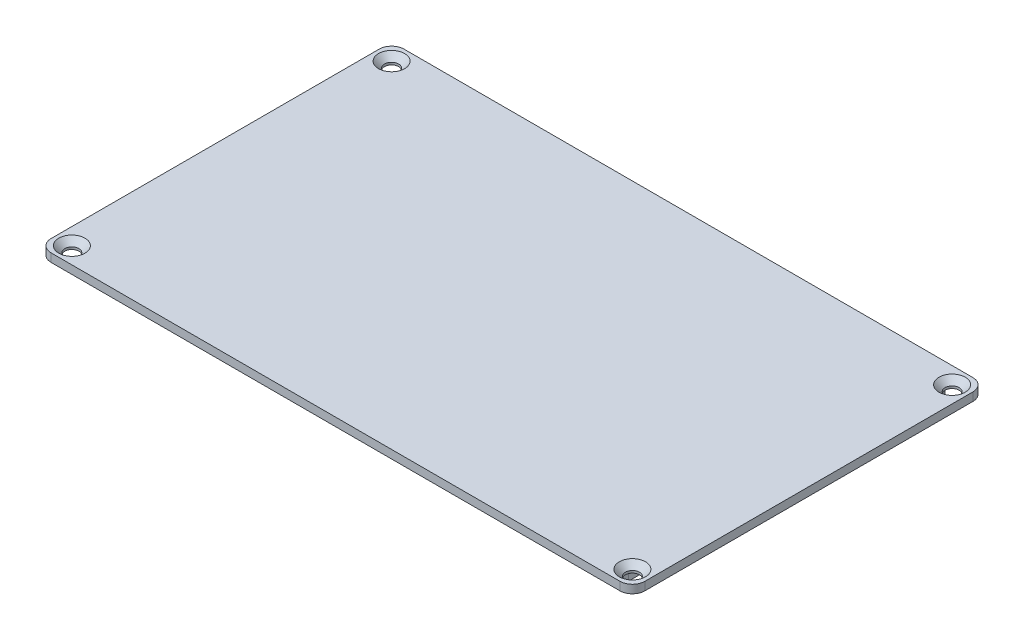
ISO-10303-21;
HEADER;
FILE_DESCRIPTION(('STEP AP214'),'2;1');
FILE_NAME('part.step','',(''),(''),'','','');
FILE_SCHEMA(('AUTOMOTIVE_DESIGN { 1 0 10303 214 1 1 1 1 }'));
ENDSEC;
DATA;
#1=APPLICATION_CONTEXT('core data for automotive mechanical design processes');
#2=APPLICATION_PROTOCOL_DEFINITION('international standard','automotive_design',2000,#1);
#3=PRODUCT_CONTEXT('',#1,'mechanical');
#4=PRODUCT('Part','Part','',(#3));
#5=PRODUCT_RELATED_PRODUCT_CATEGORY('part','',(#4));
#6=PRODUCT_DEFINITION_FORMATION('','',#4);
#7=PRODUCT_DEFINITION_CONTEXT('part definition',#1,'design');
#8=PRODUCT_DEFINITION('design','',#6,#7);
#9=PRODUCT_DEFINITION_SHAPE('','',#8);
#10=(LENGTH_UNIT() NAMED_UNIT(*) SI_UNIT(.MILLI.,.METRE.));
#11=(NAMED_UNIT(*) PLANE_ANGLE_UNIT() SI_UNIT($,.RADIAN.));
#12=(NAMED_UNIT(*) SI_UNIT($,.STERADIAN.) SOLID_ANGLE_UNIT());
#13=UNCERTAINTY_MEASURE_WITH_UNIT(LENGTH_MEASURE(1.E-05),#10,'distance_accuracy_value','');
#14=(GEOMETRIC_REPRESENTATION_CONTEXT(3) GLOBAL_UNCERTAINTY_ASSIGNED_CONTEXT((#13)) GLOBAL_UNIT_ASSIGNED_CONTEXT((#10,
#11,#12)) REPRESENTATION_CONTEXT('',''));
#15=CARTESIAN_POINT('',(0.,0.,0.));
#16=DIRECTION('',(0.,0.,1.));
#17=DIRECTION('',(1.,0.,0.));
#18=AXIS2_PLACEMENT_3D('',#15,#16,#17);
#19=CARTESIAN_POINT('',(0.,0.,0.));
#20=DIRECTION('',(0.,-1.,0.));
#21=DIRECTION('',(0.,0.,-1.));
#22=AXIS2_PLACEMENT_3D('',#19,#20,#21);
#23=PLANE('',#22);
#24=DIRECTION('',(0.,0.,-1.));
#25=VECTOR('',#24,1.);
#26=CARTESIAN_POINT('',(131.,0.,0.));
#27=LINE('',#26,#25);
#28=CARTESIAN_POINT('',(131.,0.,-3.));
#29=VERTEX_POINT('',#28);
#30=CARTESIAN_POINT('',(131.,0.,-78.));
#31=VERTEX_POINT('',#30);
#32=EDGE_CURVE('E224',#29,#31,#27,.T.);
#33=ORIENTED_EDGE('',*,*,#32,.F.);
#34=CARTESIAN_POINT('',(128.,0.,-3.));
#35=DIRECTION('',(0.,-1.,0.));
#36=DIRECTION('',(0.,0.,-1.));
#37=AXIS2_PLACEMENT_3D('',#34,#35,#36);
#38=CIRCLE('',#37,3.);
#39=CARTESIAN_POINT('',(128.,0.,0.));
#40=VERTEX_POINT('',#39);
#41=EDGE_CURVE('E239',#29,#40,#38,.T.);
#42=ORIENTED_EDGE('',*,*,#41,.T.);
#43=DIRECTION('',(1.,0.,0.));
#44=VECTOR('',#43,1.);
#45=CARTESIAN_POINT('',(0.,0.,0.));
#46=LINE('',#45,#44);
#47=CARTESIAN_POINT('',(3.,0.,0.));
#48=VERTEX_POINT('',#47);
#49=EDGE_CURVE('E202',#48,#40,#46,.T.);
#50=ORIENTED_EDGE('',*,*,#49,.F.);
#51=CARTESIAN_POINT('',(3.,0.,-3.));
#52=DIRECTION('',(0.,-1.,0.));
#53=DIRECTION('',(0.,0.,-1.));
#54=AXIS2_PLACEMENT_3D('',#51,#52,#53);
#55=CIRCLE('',#54,3.);
#56=CARTESIAN_POINT('',(0.,0.,-3.));
#57=VERTEX_POINT('',#56);
#58=EDGE_CURVE('E237',#48,#57,#55,.T.);
#59=ORIENTED_EDGE('',*,*,#58,.T.);
#60=DIRECTION('',(0.,0.,1.));
#61=VECTOR('',#60,1.);
#62=CARTESIAN_POINT('',(0.,0.,0.));
#63=LINE('',#62,#61);
#64=CARTESIAN_POINT('',(0.,0.,-78.));
#65=VERTEX_POINT('',#64);
#66=EDGE_CURVE('E198',#65,#57,#63,.T.);
#67=ORIENTED_EDGE('',*,*,#66,.F.);
#68=CARTESIAN_POINT('',(3.,0.,-78.));
#69=DIRECTION('',(0.,-1.,0.));
#70=DIRECTION('',(0.,0.,-1.));
#71=AXIS2_PLACEMENT_3D('',#68,#69,#70);
#72=CIRCLE('',#71,3.);
#73=CARTESIAN_POINT('',(3.,0.,-81.));
#74=VERTEX_POINT('',#73);
#75=EDGE_CURVE('E235',#65,#74,#72,.T.);
#76=ORIENTED_EDGE('',*,*,#75,.T.);
#77=DIRECTION('',(-1.,0.,0.));
#78=VECTOR('',#77,1.);
#79=CARTESIAN_POINT('',(0.,0.,-81.));
#80=LINE('',#79,#78);
#81=CARTESIAN_POINT('',(128.,0.,-81.));
#82=VERTEX_POINT('',#81);
#83=EDGE_CURVE('E212',#82,#74,#80,.T.);
#84=ORIENTED_EDGE('',*,*,#83,.F.);
#85=CARTESIAN_POINT('',(128.,0.,-78.));
#86=DIRECTION('',(0.,-1.,0.));
#87=DIRECTION('',(0.,0.,-1.));
#88=AXIS2_PLACEMENT_3D('',#85,#86,#87);
#89=CIRCLE('',#88,3.);
#90=EDGE_CURVE('E233',#82,#31,#89,.T.);
#91=ORIENTED_EDGE('',*,*,#90,.T.);
#92=EDGE_LOOP('',(#33,#42,#50,#59,#67,#76,#84,#91));
#93=FACE_BOUND('',#92,.T.);
#94=DIRECTION('',(-1.,0.,0.));
#95=VECTOR('',#94,1.);
#96=CARTESIAN_POINT('',(2.,0.,-79.));
#97=LINE('',#96,#95);
#98=CARTESIAN_POINT('',(129.,0.,-79.));
#99=VERTEX_POINT('',#98);
#100=CARTESIAN_POINT('',(2.,0.,-79.));
#101=VERTEX_POINT('',#100);
#102=EDGE_CURVE('E193',#99,#101,#97,.T.);
#103=ORIENTED_EDGE('',*,*,#102,.T.);
#104=DIRECTION('',(0.,0.,1.));
#105=VECTOR('',#104,1.);
#106=CARTESIAN_POINT('',(2.,0.,-2.));
#107=LINE('',#106,#105);
#108=CARTESIAN_POINT('',(2.,0.,-2.));
#109=VERTEX_POINT('',#108);
#110=EDGE_CURVE('E338',#101,#109,#107,.T.);
#111=ORIENTED_EDGE('',*,*,#110,.T.);
#112=DIRECTION('',(1.,0.,0.));
#113=VECTOR('',#112,1.);
#114=CARTESIAN_POINT('',(2.,0.,-2.));
#115=LINE('',#114,#113);
#116=CARTESIAN_POINT('',(129.,0.,-2.));
#117=VERTEX_POINT('',#116);
#118=EDGE_CURVE('E197',#109,#117,#115,.T.);
#119=ORIENTED_EDGE('',*,*,#118,.T.);
#120=DIRECTION('',(0.,0.,-1.));
#121=VECTOR('',#120,1.);
#122=CARTESIAN_POINT('',(129.,0.,-2.));
#123=LINE('',#122,#121);
#124=EDGE_CURVE('E353',#117,#99,#123,.T.);
#125=ORIENTED_EDGE('',*,*,#124,.T.);
#126=EDGE_LOOP('',(#103,#111,#119,#125));
#127=FACE_BOUND('',#126,.T.);
#128=ADVANCED_FACE('F35',(#93,#127),#23,.T.);
#129=CARTESIAN_POINT('',(0.,2.,0.));
#130=DIRECTION('',(1.,0.,0.));
#131=DIRECTION('',(0.,0.,-1.));
#132=AXIS2_PLACEMENT_3D('',#129,#130,#131);
#133=PLANE('',#132);
#134=ORIENTED_EDGE('',*,*,#66,.T.);
#135=DIRECTION('',(0.,-1.,0.));
#136=VECTOR('',#135,1.);
#137=CARTESIAN_POINT('',(0.,2.,-3.));
#138=LINE('',#137,#136);
#139=CARTESIAN_POINT('',(0.,2.,-3.));
#140=VERTEX_POINT('',#139);
#141=EDGE_CURVE('E283',#57,#140,#138,.F.);
#142=ORIENTED_EDGE('',*,*,#141,.T.);
#143=DIRECTION('',(0.,0.,1.));
#144=VECTOR('',#143,1.);
#145=CARTESIAN_POINT('',(0.,2.,0.));
#146=LINE('',#145,#144);
#147=CARTESIAN_POINT('',(0.,2.,-78.));
#148=VERTEX_POINT('',#147);
#149=EDGE_CURVE('E208',#148,#140,#146,.T.);
#150=ORIENTED_EDGE('',*,*,#149,.F.);
#151=DIRECTION('',(0.,-1.,0.));
#152=VECTOR('',#151,1.);
#153=CARTESIAN_POINT('',(0.,2.,-78.));
#154=LINE('',#153,#152);
#155=EDGE_CURVE('E280',#148,#65,#154,.T.);
#156=ORIENTED_EDGE('',*,*,#155,.T.);
#157=EDGE_LOOP('',(#134,#142,#150,#156));
#158=FACE_BOUND('',#157,.T.);
#159=ADVANCED_FACE('F367',(#158),#133,.F.);
#160=CARTESIAN_POINT('',(0.,2.,0.));
#161=DIRECTION('',(0.,0.,-1.));
#162=DIRECTION('',(-1.,0.,0.));
#163=AXIS2_PLACEMENT_3D('',#160,#161,#162);
#164=PLANE('',#163);
#165=ORIENTED_EDGE('',*,*,#49,.T.);
#166=DIRECTION('',(0.,-1.,0.));
#167=VECTOR('',#166,1.);
#168=CARTESIAN_POINT('',(128.,2.,0.));
#169=LINE('',#168,#167);
#170=CARTESIAN_POINT('',(128.,2.,0.));
#171=VERTEX_POINT('',#170);
#172=EDGE_CURVE('E244',#40,#171,#169,.F.);
#173=ORIENTED_EDGE('',*,*,#172,.T.);
#174=DIRECTION('',(1.,0.,0.));
#175=VECTOR('',#174,1.);
#176=CARTESIAN_POINT('',(0.,2.,0.));
#177=LINE('',#176,#175);
#178=CARTESIAN_POINT('',(3.,2.,0.));
#179=VERTEX_POINT('',#178);
#180=EDGE_CURVE('E211',#179,#171,#177,.T.);
#181=ORIENTED_EDGE('',*,*,#180,.F.);
#182=DIRECTION('',(0.,-1.,0.));
#183=VECTOR('',#182,1.);
#184=CARTESIAN_POINT('',(3.,2.,0.));
#185=LINE('',#184,#183);
#186=EDGE_CURVE('E241',#179,#48,#185,.T.);
#187=ORIENTED_EDGE('',*,*,#186,.T.);
#188=EDGE_LOOP('',(#165,#173,#181,#187));
#189=FACE_BOUND('',#188,.T.);
#190=ADVANCED_FACE('F373',(#189),#164,.F.);
#191=CARTESIAN_POINT('',(131.,2.,0.));
#192=DIRECTION('',(-1.,0.,0.));
#193=DIRECTION('',(0.,0.,1.));
#194=AXIS2_PLACEMENT_3D('',#191,#192,#193);
#195=PLANE('',#194);
#196=DIRECTION('',(0.,0.,-1.));
#197=VECTOR('',#196,1.);
#198=CARTESIAN_POINT('',(131.,2.,0.));
#199=LINE('',#198,#197);
#200=CARTESIAN_POINT('',(131.,2.,-3.));
#201=VERTEX_POINT('',#200);
#202=CARTESIAN_POINT('',(131.,2.,-78.));
#203=VERTEX_POINT('',#202);
#204=EDGE_CURVE('E215',#201,#203,#199,.T.);
#205=ORIENTED_EDGE('',*,*,#204,.F.);
#206=DIRECTION('',(0.,-1.,0.));
#207=VECTOR('',#206,1.);
#208=CARTESIAN_POINT('',(131.,2.,-3.));
#209=LINE('',#208,#207);
#210=EDGE_CURVE('E230',#201,#29,#209,.T.);
#211=ORIENTED_EDGE('',*,*,#210,.T.);
#212=ORIENTED_EDGE('',*,*,#32,.T.);
#213=DIRECTION('',(0.,-1.,0.));
#214=VECTOR('',#213,1.);
#215=CARTESIAN_POINT('',(131.,2.,-78.));
#216=LINE('',#215,#214);
#217=EDGE_CURVE('E220',#31,#203,#216,.F.);
#218=ORIENTED_EDGE('',*,*,#217,.T.);
#219=EDGE_LOOP('',(#205,#211,#212,#218));
#220=FACE_BOUND('',#219,.T.);
#221=ADVANCED_FACE('F383',(#220),#195,.F.);
#222=CARTESIAN_POINT('',(0.,2.,-81.));
#223=DIRECTION('',(0.,0.,1.));
#224=DIRECTION('',(1.,0.,0.));
#225=AXIS2_PLACEMENT_3D('',#222,#223,#224);
#226=PLANE('',#225);
#227=ORIENTED_EDGE('',*,*,#83,.T.);
#228=DIRECTION('',(0.,-1.,0.));
#229=VECTOR('',#228,1.);
#230=CARTESIAN_POINT('',(3.,2.,-81.));
#231=LINE('',#230,#229);
#232=CARTESIAN_POINT('',(3.,2.,-81.));
#233=VERTEX_POINT('',#232);
#234=EDGE_CURVE('E288',#74,#233,#231,.F.);
#235=ORIENTED_EDGE('',*,*,#234,.T.);
#236=DIRECTION('',(-1.,0.,0.));
#237=VECTOR('',#236,1.);
#238=CARTESIAN_POINT('',(0.,2.,-81.));
#239=LINE('',#238,#237);
#240=CARTESIAN_POINT('',(128.,2.,-81.));
#241=VERTEX_POINT('',#240);
#242=EDGE_CURVE('E218',#241,#233,#239,.T.);
#243=ORIENTED_EDGE('',*,*,#242,.F.);
#244=DIRECTION('',(0.,-1.,0.));
#245=VECTOR('',#244,1.);
#246=CARTESIAN_POINT('',(128.,2.,-81.));
#247=LINE('',#246,#245);
#248=EDGE_CURVE('E285',#241,#82,#247,.T.);
#249=ORIENTED_EDGE('',*,*,#248,.T.);
#250=EDGE_LOOP('',(#227,#235,#243,#249));
#251=FACE_BOUND('',#250,.T.);
#252=ADVANCED_FACE('F380',(#251),#226,.F.);
#253=CARTESIAN_POINT('',(2.,2.,-2.));
#254=DIRECTION('',(1.,0.,0.));
#255=DIRECTION('',(0.,0.,-1.));
#256=AXIS2_PLACEMENT_3D('',#253,#254,#255);
#257=PLANE('',#256);
#258=ORIENTED_EDGE('',*,*,#110,.F.);
#259=DIRECTION('',(0.,-1.,0.));
#260=VECTOR('',#259,1.);
#261=CARTESIAN_POINT('',(2.,2.,-79.));
#262=LINE('',#261,#260);
#263=CARTESIAN_POINT('',(2.,2.,-79.));
#264=VERTEX_POINT('',#263);
#265=EDGE_CURVE('E192',#264,#101,#262,.T.);
#266=ORIENTED_EDGE('',*,*,#265,.F.);
#267=DIRECTION('',(0.,0.,1.));
#268=VECTOR('',#267,1.);
#269=CARTESIAN_POINT('',(2.,2.,-2.));
#270=LINE('',#269,#268);
#271=CARTESIAN_POINT('',(2.,2.,-2.));
#272=VERTEX_POINT('',#271);
#273=EDGE_CURVE('E177',#264,#272,#270,.T.);
#274=ORIENTED_EDGE('',*,*,#273,.T.);
#275=DIRECTION('',(0.,-1.,0.));
#276=VECTOR('',#275,1.);
#277=CARTESIAN_POINT('',(2.,2.,-2.));
#278=LINE('',#277,#276);
#279=EDGE_CURVE('E189',#272,#109,#278,.T.);
#280=ORIENTED_EDGE('',*,*,#279,.T.);
#281=EDGE_LOOP('',(#258,#266,#274,#280));
#282=FACE_BOUND('',#281,.T.);
#283=ADVANCED_FACE('F188',(#282),#257,.T.);
#284=CARTESIAN_POINT('',(2.,2.,-2.));
#285=DIRECTION('',(0.,0.,-1.));
#286=DIRECTION('',(-1.,0.,0.));
#287=AXIS2_PLACEMENT_3D('',#284,#285,#286);
#288=PLANE('',#287);
#289=ORIENTED_EDGE('',*,*,#118,.F.);
#290=ORIENTED_EDGE('',*,*,#279,.F.);
#291=DIRECTION('',(1.,0.,0.));
#292=VECTOR('',#291,1.);
#293=CARTESIAN_POINT('',(2.,2.,-2.));
#294=LINE('',#293,#292);
#295=CARTESIAN_POINT('',(129.,2.,-2.));
#296=VERTEX_POINT('',#295);
#297=EDGE_CURVE('E174',#272,#296,#294,.T.);
#298=ORIENTED_EDGE('',*,*,#297,.T.);
#299=DIRECTION('',(0.,-1.,0.));
#300=VECTOR('',#299,1.);
#301=CARTESIAN_POINT('',(129.,2.,-2.));
#302=LINE('',#301,#300);
#303=EDGE_CURVE('E199',#296,#117,#302,.T.);
#304=ORIENTED_EDGE('',*,*,#303,.T.);
#305=EDGE_LOOP('',(#289,#290,#298,#304));
#306=FACE_BOUND('',#305,.T.);
#307=ADVANCED_FACE('F195',(#306),#288,.T.);
#308=CARTESIAN_POINT('',(129.,2.,-2.));
#309=DIRECTION('',(-1.,0.,0.));
#310=DIRECTION('',(0.,0.,1.));
#311=AXIS2_PLACEMENT_3D('',#308,#309,#310);
#312=PLANE('',#311);
#313=ORIENTED_EDGE('',*,*,#124,.F.);
#314=ORIENTED_EDGE('',*,*,#303,.F.);
#315=DIRECTION('',(0.,0.,-1.));
#316=VECTOR('',#315,1.);
#317=CARTESIAN_POINT('',(129.,2.,-2.));
#318=LINE('',#317,#316);
#319=CARTESIAN_POINT('',(129.,2.,-79.));
#320=VERTEX_POINT('',#319);
#321=EDGE_CURVE('E180',#296,#320,#318,.T.);
#322=ORIENTED_EDGE('',*,*,#321,.T.);
#323=DIRECTION('',(0.,-1.,0.));
#324=VECTOR('',#323,1.);
#325=CARTESIAN_POINT('',(129.,2.,-79.));
#326=LINE('',#325,#324);
#327=EDGE_CURVE('E204',#320,#99,#326,.T.);
#328=ORIENTED_EDGE('',*,*,#327,.T.);
#329=EDGE_LOOP('',(#313,#314,#322,#328));
#330=FACE_BOUND('',#329,.T.);
#331=ADVANCED_FACE('F362',(#330),#312,.T.);
#332=CARTESIAN_POINT('',(2.,2.,-79.));
#333=DIRECTION('',(0.,0.,1.));
#334=DIRECTION('',(1.,0.,0.));
#335=AXIS2_PLACEMENT_3D('',#332,#333,#334);
#336=PLANE('',#335);
#337=ORIENTED_EDGE('',*,*,#102,.F.);
#338=ORIENTED_EDGE('',*,*,#327,.F.);
#339=DIRECTION('',(-1.,0.,0.));
#340=VECTOR('',#339,1.);
#341=CARTESIAN_POINT('',(2.,2.,-79.));
#342=LINE('',#341,#340);
#343=EDGE_CURVE('E349',#320,#264,#342,.T.);
#344=ORIENTED_EDGE('',*,*,#343,.T.);
#345=ORIENTED_EDGE('',*,*,#265,.T.);
#346=EDGE_LOOP('',(#337,#338,#344,#345));
#347=FACE_BOUND('',#346,.T.);
#348=ADVANCED_FACE('F364',(#347),#336,.T.);
#349=CARTESIAN_POINT('',(0.,2.,0.));
#350=DIRECTION('',(0.,-1.,0.));
#351=DIRECTION('',(0.,0.,-1.));
#352=AXIS2_PLACEMENT_3D('',#349,#350,#351);
#353=PLANE('',#352);
#354=ORIENTED_EDGE('',*,*,#273,.F.);
#355=ORIENTED_EDGE('',*,*,#343,.F.);
#356=ORIENTED_EDGE('',*,*,#321,.F.);
#357=ORIENTED_EDGE('',*,*,#297,.F.);
#358=EDGE_LOOP('',(#354,#355,#356,#357));
#359=FACE_BOUND('',#358,.T.);
#360=ADVANCED_FACE('F176',(#359),#353,.T.);
#361=CARTESIAN_POINT('',(-6.,4.,2.));
#362=DIRECTION('',(1.,0.,0.));
#363=DIRECTION('',(0.,0.,-1.));
#364=AXIS2_PLACEMENT_3D('',#361,#362,#363);
#365=PLANE('',#364);
#366=DIRECTION('',(0.,0.,1.));
#367=VECTOR('',#366,1.);
#368=CARTESIAN_POINT('',(-6.,4.,2.));
#369=LINE('',#368,#367);
#370=CARTESIAN_POINT('',(-6.,4.,-80.));
#371=VERTEX_POINT('',#370);
#372=CARTESIAN_POINT('',(-6.,4.,-1.));
#373=VERTEX_POINT('',#372);
#374=EDGE_CURVE('E327',#371,#373,#369,.T.);
#375=ORIENTED_EDGE('',*,*,#374,.F.);
#376=DIRECTION('',(0.,-1.,0.));
#377=VECTOR('',#376,1.);
#378=CARTESIAN_POINT('',(-6.,4.,-80.));
#379=LINE('',#378,#377);
#380=CARTESIAN_POINT('',(-6.,2.,-80.));
#381=VERTEX_POINT('',#380);
#382=EDGE_CURVE('E277',#371,#381,#379,.T.);
#383=ORIENTED_EDGE('',*,*,#382,.T.);
#384=DIRECTION('',(0.,0.,1.));
#385=VECTOR('',#384,1.);
#386=CARTESIAN_POINT('',(-6.,2.,2.));
#387=LINE('',#386,#385);
#388=CARTESIAN_POINT('',(-6.,2.,-1.));
#389=VERTEX_POINT('',#388);
#390=EDGE_CURVE('E298',#381,#389,#387,.T.);
#391=ORIENTED_EDGE('',*,*,#390,.T.);
#392=DIRECTION('',(0.,-1.,0.));
#393=VECTOR('',#392,1.);
#394=CARTESIAN_POINT('',(-6.,4.,-1.));
#395=LINE('',#394,#393);
#396=EDGE_CURVE('E275',#389,#373,#395,.F.);
#397=ORIENTED_EDGE('',*,*,#396,.T.);
#398=EDGE_LOOP('',(#375,#383,#391,#397));
#399=FACE_BOUND('',#398,.T.);
#400=ADVANCED_FACE('F463',(#399),#365,.F.);
#401=CARTESIAN_POINT('',(-6.,4.,2.));
#402=DIRECTION('',(0.,0.,-1.));
#403=DIRECTION('',(-1.,0.,0.));
#404=AXIS2_PLACEMENT_3D('',#401,#402,#403);
#405=PLANE('',#404);
#406=DIRECTION('',(1.,0.,0.));
#407=VECTOR('',#406,1.);
#408=CARTESIAN_POINT('',(-6.,2.,2.));
#409=LINE('',#408,#407);
#410=CARTESIAN_POINT('',(-3.,2.,2.));
#411=VERTEX_POINT('',#410);
#412=CARTESIAN_POINT('',(134.,2.,2.));
#413=VERTEX_POINT('',#412);
#414=EDGE_CURVE('E341',#411,#413,#409,.T.);
#415=ORIENTED_EDGE('',*,*,#414,.T.);
#416=DIRECTION('',(0.,-1.,0.));
#417=VECTOR('',#416,1.);
#418=CARTESIAN_POINT('',(134.,4.,2.));
#419=LINE('',#418,#417);
#420=CARTESIAN_POINT('',(134.,4.,2.));
#421=VERTEX_POINT('',#420);
#422=EDGE_CURVE('E262',#413,#421,#419,.F.);
#423=ORIENTED_EDGE('',*,*,#422,.T.);
#424=DIRECTION('',(1.,0.,0.));
#425=VECTOR('',#424,1.);
#426=CARTESIAN_POINT('',(-6.,4.,2.));
#427=LINE('',#426,#425);
#428=CARTESIAN_POINT('',(-3.,4.,2.));
#429=VERTEX_POINT('',#428);
#430=EDGE_CURVE('E330',#429,#421,#427,.T.);
#431=ORIENTED_EDGE('',*,*,#430,.F.);
#432=DIRECTION('',(0.,-1.,0.));
#433=VECTOR('',#432,1.);
#434=CARTESIAN_POINT('',(-3.,4.,2.));
#435=LINE('',#434,#433);
#436=EDGE_CURVE('E259',#429,#411,#435,.T.);
#437=ORIENTED_EDGE('',*,*,#436,.T.);
#438=EDGE_LOOP('',(#415,#423,#431,#437));
#439=FACE_BOUND('',#438,.T.);
#440=ADVANCED_FACE('F469',(#439),#405,.F.);
#441=CARTESIAN_POINT('',(137.,4.,2.));
#442=DIRECTION('',(-1.,0.,0.));
#443=DIRECTION('',(0.,0.,1.));
#444=AXIS2_PLACEMENT_3D('',#441,#442,#443);
#445=PLANE('',#444);
#446=DIRECTION('',(0.,0.,-1.));
#447=VECTOR('',#446,1.);
#448=CARTESIAN_POINT('',(137.,4.,2.));
#449=LINE('',#448,#447);
#450=CARTESIAN_POINT('',(137.,4.,-1.));
#451=VERTEX_POINT('',#450);
#452=CARTESIAN_POINT('',(137.,4.,-80.));
#453=VERTEX_POINT('',#452);
#454=EDGE_CURVE('E334',#451,#453,#449,.T.);
#455=ORIENTED_EDGE('',*,*,#454,.F.);
#456=DIRECTION('',(0.,-1.,0.));
#457=VECTOR('',#456,1.);
#458=CARTESIAN_POINT('',(137.,4.,-1.));
#459=LINE('',#458,#457);
#460=CARTESIAN_POINT('',(137.,2.,-1.));
#461=VERTEX_POINT('',#460);
#462=EDGE_CURVE('E248',#451,#461,#459,.T.);
#463=ORIENTED_EDGE('',*,*,#462,.T.);
#464=DIRECTION('',(0.,0.,-1.));
#465=VECTOR('',#464,1.);
#466=CARTESIAN_POINT('',(137.,2.,2.));
#467=LINE('',#466,#465);
#468=CARTESIAN_POINT('',(137.,2.,-80.));
#469=VERTEX_POINT('',#468);
#470=EDGE_CURVE('E344',#461,#469,#467,.T.);
#471=ORIENTED_EDGE('',*,*,#470,.T.);
#472=DIRECTION('',(0.,-1.,0.));
#473=VECTOR('',#472,1.);
#474=CARTESIAN_POINT('',(137.,4.,-80.));
#475=LINE('',#474,#473);
#476=EDGE_CURVE('E246',#469,#453,#475,.F.);
#477=ORIENTED_EDGE('',*,*,#476,.T.);
#478=EDGE_LOOP('',(#455,#463,#471,#477));
#479=FACE_BOUND('',#478,.T.);
#480=ADVANCED_FACE('F454',(#479),#445,.F.);
#481=CARTESIAN_POINT('',(-6.,4.,-83.));
#482=DIRECTION('',(0.,0.,1.));
#483=DIRECTION('',(1.,0.,0.));
#484=AXIS2_PLACEMENT_3D('',#481,#482,#483);
#485=PLANE('',#484);
#486=DIRECTION('',(-1.,0.,0.));
#487=VECTOR('',#486,1.);
#488=CARTESIAN_POINT('',(-6.,4.,-83.));
#489=LINE('',#488,#487);
#490=CARTESIAN_POINT('',(134.,4.,-83.));
#491=VERTEX_POINT('',#490);
#492=CARTESIAN_POINT('',(-3.,4.,-83.));
#493=VERTEX_POINT('',#492);
#494=EDGE_CURVE('E336',#491,#493,#489,.T.);
#495=ORIENTED_EDGE('',*,*,#494,.F.);
#496=DIRECTION('',(0.,-1.,0.));
#497=VECTOR('',#496,1.);
#498=CARTESIAN_POINT('',(134.,4.,-83.));
#499=LINE('',#498,#497);
#500=CARTESIAN_POINT('',(134.,2.,-83.));
#501=VERTEX_POINT('',#500);
#502=EDGE_CURVE('E272',#491,#501,#499,.T.);
#503=ORIENTED_EDGE('',*,*,#502,.T.);
#504=DIRECTION('',(-1.,0.,0.));
#505=VECTOR('',#504,1.);
#506=CARTESIAN_POINT('',(-6.,2.,-83.));
#507=LINE('',#506,#505);
#508=CARTESIAN_POINT('',(-3.,2.,-83.));
#509=VERTEX_POINT('',#508);
#510=EDGE_CURVE('E331',#501,#509,#507,.T.);
#511=ORIENTED_EDGE('',*,*,#510,.T.);
#512=DIRECTION('',(0.,-1.,0.));
#513=VECTOR('',#512,1.);
#514=CARTESIAN_POINT('',(-3.,4.,-83.));
#515=LINE('',#514,#513);
#516=EDGE_CURVE('E52',#509,#493,#515,.F.);
#517=ORIENTED_EDGE('',*,*,#516,.T.);
#518=EDGE_LOOP('',(#495,#503,#511,#517));
#519=FACE_BOUND('',#518,.T.);
#520=ADVANCED_FACE('F457',(#519),#485,.F.);
#521=CARTESIAN_POINT('',(0.,4.,0.));
#522=DIRECTION('',(0.,-1.,0.));
#523=DIRECTION('',(0.,0.,-1.));
#524=AXIS2_PLACEMENT_3D('',#521,#522,#523);
#525=PLANE('',#524);
#526=CARTESIAN_POINT('',(-2.,4.,-2.));
#527=DIRECTION('',(0.,1.,0.));
#528=DIRECTION('',(0.,0.,1.));
#529=AXIS2_PLACEMENT_3D('',#526,#527,#528);
#530=CIRCLE('',#529,3.15);
#531=CARTESIAN_POINT('',(-2.,4.,1.15));
#532=VERTEX_POINT('',#531);
#533=EDGE_CURVE('E714',#532,#532,#530,.T.);
#534=ORIENTED_EDGE('',*,*,#533,.F.);
#535=EDGE_LOOP('',(#534));
#536=FACE_BOUND('',#535,.T.);
#537=CARTESIAN_POINT('',(133.,4.,-79.));
#538=DIRECTION('',(0.,1.,0.));
#539=DIRECTION('',(0.,0.,1.));
#540=AXIS2_PLACEMENT_3D('',#537,#538,#539);
#541=CIRCLE('',#540,3.14999999999999);
#542=CARTESIAN_POINT('',(133.,4.,-75.85));
#543=VERTEX_POINT('',#542);
#544=EDGE_CURVE('E313',#543,#543,#541,.T.);
#545=ORIENTED_EDGE('',*,*,#544,.F.);
#546=EDGE_LOOP('',(#545));
#547=FACE_BOUND('',#546,.T.);
#548=CARTESIAN_POINT('',(-2.,4.,-79.));
#549=DIRECTION('',(0.,1.,0.));
#550=DIRECTION('',(0.,0.,1.));
#551=AXIS2_PLACEMENT_3D('',#548,#549,#550);
#552=CIRCLE('',#551,3.15);
#553=CARTESIAN_POINT('',(-2.,4.,-75.85));
#554=VERTEX_POINT('',#553);
#555=EDGE_CURVE('E306',#554,#554,#552,.T.);
#556=ORIENTED_EDGE('',*,*,#555,.F.);
#557=EDGE_LOOP('',(#556));
#558=FACE_BOUND('',#557,.T.);
#559=CARTESIAN_POINT('',(133.,4.,-2.));
#560=DIRECTION('',(0.,1.,0.));
#561=DIRECTION('',(0.,0.,1.));
#562=AXIS2_PLACEMENT_3D('',#559,#560,#561);
#563=CIRCLE('',#562,3.14999999999999);
#564=CARTESIAN_POINT('',(133.,4.,1.14999999999999));
#565=VERTEX_POINT('',#564);
#566=EDGE_CURVE('E302',#565,#565,#563,.T.);
#567=ORIENTED_EDGE('',*,*,#566,.F.);
#568=EDGE_LOOP('',(#567));
#569=FACE_BOUND('',#568,.T.);
#570=ORIENTED_EDGE('',*,*,#430,.T.);
#571=CARTESIAN_POINT('',(134.,4.,-1.));
#572=DIRECTION('',(0.,-1.,0.));
#573=DIRECTION('',(0.,0.,-1.));
#574=AXIS2_PLACEMENT_3D('',#571,#572,#573);
#575=CIRCLE('',#574,3.);
#576=EDGE_CURVE('E269',#421,#451,#575,.F.);
#577=ORIENTED_EDGE('',*,*,#576,.T.);
#578=ORIENTED_EDGE('',*,*,#454,.T.);
#579=CARTESIAN_POINT('',(134.,4.,-80.));
#580=DIRECTION('',(0.,-1.,0.));
#581=DIRECTION('',(0.,0.,-1.));
#582=AXIS2_PLACEMENT_3D('',#579,#580,#581);
#583=CIRCLE('',#582,3.);
#584=EDGE_CURVE('E59',#453,#491,#583,.F.);
#585=ORIENTED_EDGE('',*,*,#584,.T.);
#586=ORIENTED_EDGE('',*,*,#494,.T.);
#587=CARTESIAN_POINT('',(-3.,4.,-80.));
#588=DIRECTION('',(0.,-1.,0.));
#589=DIRECTION('',(0.,0.,-1.));
#590=AXIS2_PLACEMENT_3D('',#587,#588,#589);
#591=CIRCLE('',#590,3.);
#592=EDGE_CURVE('E266',#493,#371,#591,.F.);
#593=ORIENTED_EDGE('',*,*,#592,.T.);
#594=ORIENTED_EDGE('',*,*,#374,.T.);
#595=CARTESIAN_POINT('',(-3.,4.,-1.));
#596=DIRECTION('',(0.,-1.,0.));
#597=DIRECTION('',(0.,0.,-1.));
#598=AXIS2_PLACEMENT_3D('',#595,#596,#597);
#599=CIRCLE('',#598,3.);
#600=EDGE_CURVE('E264',#373,#429,#599,.F.);
#601=ORIENTED_EDGE('',*,*,#600,.T.);
#602=EDGE_LOOP('',(#570,#577,#578,#585,#586,#593,#594,#601));
#603=FACE_BOUND('',#602,.T.);
#604=ADVANCED_FACE('F445',(#536,#547,#558,#569,#603),#525,.F.);
#605=CARTESIAN_POINT('',(-2.,2.,-2.));
#606=DIRECTION('',(0.,-1.,0.));
#607=DIRECTION('',(0.,0.,-1.));
#608=AXIS2_PLACEMENT_3D('',#605,#606,#607);
#609=CIRCLE('',#608,1.7);
#610=CARTESIAN_POINT('',(-2.,2.,-3.7));
#611=VERTEX_POINT('',#610);
#612=EDGE_CURVE('E39',#611,#611,#609,.T.);
#613=ORIENTED_EDGE('',*,*,#612,.F.);
#614=EDGE_LOOP('',(#613));
#615=FACE_BOUND('',#614,.T.);
#616=CARTESIAN_POINT('',(133.,2.,-79.));
#617=DIRECTION('',(0.,-1.,0.));
#618=DIRECTION('',(0.,0.,-1.));
#619=AXIS2_PLACEMENT_3D('',#616,#617,#618);
#620=CIRCLE('',#619,1.70000000000001);
#621=CARTESIAN_POINT('',(133.,2.,-80.7));
#622=VERTEX_POINT('',#621);
#623=EDGE_CURVE('E304',#622,#622,#620,.T.);
#624=ORIENTED_EDGE('',*,*,#623,.F.);
#625=EDGE_LOOP('',(#624));
#626=FACE_BOUND('',#625,.T.);
#627=CARTESIAN_POINT('',(-2.,2.,-79.));
#628=DIRECTION('',(0.,-1.,0.));
#629=DIRECTION('',(0.,0.,-1.));
#630=AXIS2_PLACEMENT_3D('',#627,#628,#629);
#631=CIRCLE('',#630,1.7);
#632=CARTESIAN_POINT('',(-2.,2.,-80.7));
#633=VERTEX_POINT('',#632);
#634=EDGE_CURVE('E300',#633,#633,#631,.T.);
#635=ORIENTED_EDGE('',*,*,#634,.F.);
#636=EDGE_LOOP('',(#635));
#637=FACE_BOUND('',#636,.T.);
#638=CARTESIAN_POINT('',(133.,2.,-2.));
#639=DIRECTION('',(0.,-1.,0.));
#640=DIRECTION('',(0.,0.,-1.));
#641=AXIS2_PLACEMENT_3D('',#638,#639,#640);
#642=CIRCLE('',#641,1.70000000000001);
#643=CARTESIAN_POINT('',(133.,2.,-3.70000000000001));
#644=VERTEX_POINT('',#643);
#645=EDGE_CURVE('E295',#644,#644,#642,.T.);
#646=ORIENTED_EDGE('',*,*,#645,.F.);
#647=EDGE_LOOP('',(#646));
#648=FACE_BOUND('',#647,.T.);
#649=ORIENTED_EDGE('',*,*,#204,.T.);
#650=CARTESIAN_POINT('',(128.,2.,-78.));
#651=DIRECTION('',(0.,-1.,0.));
#652=DIRECTION('',(0.,0.,-1.));
#653=AXIS2_PLACEMENT_3D('',#650,#651,#652);
#654=CIRCLE('',#653,3.);
#655=EDGE_CURVE('E11',#203,#241,#654,.F.);
#656=ORIENTED_EDGE('',*,*,#655,.T.);
#657=ORIENTED_EDGE('',*,*,#242,.T.);
#658=CARTESIAN_POINT('',(3.,2.,-78.));
#659=DIRECTION('',(0.,-1.,0.));
#660=DIRECTION('',(0.,0.,-1.));
#661=AXIS2_PLACEMENT_3D('',#658,#659,#660);
#662=CIRCLE('',#661,3.);
#663=EDGE_CURVE('E44',#233,#148,#662,.F.);
#664=ORIENTED_EDGE('',*,*,#663,.T.);
#665=ORIENTED_EDGE('',*,*,#149,.T.);
#666=CARTESIAN_POINT('',(3.,2.,-3.));
#667=DIRECTION('',(0.,-1.,0.));
#668=DIRECTION('',(0.,0.,-1.));
#669=AXIS2_PLACEMENT_3D('',#666,#667,#668);
#670=CIRCLE('',#669,3.);
#671=EDGE_CURVE('E292',#140,#179,#670,.F.);
#672=ORIENTED_EDGE('',*,*,#671,.T.);
#673=ORIENTED_EDGE('',*,*,#180,.T.);
#674=CARTESIAN_POINT('',(128.,2.,-3.));
#675=DIRECTION('',(0.,-1.,0.));
#676=DIRECTION('',(0.,0.,-1.));
#677=AXIS2_PLACEMENT_3D('',#674,#675,#676);
#678=CIRCLE('',#677,3.);
#679=EDGE_CURVE('E290',#171,#201,#678,.F.);
#680=ORIENTED_EDGE('',*,*,#679,.T.);
#681=EDGE_LOOP('',(#649,#656,#657,#664,#665,#672,#673,#680));
#682=FACE_BOUND('',#681,.T.);
#683=ORIENTED_EDGE('',*,*,#470,.F.);
#684=CARTESIAN_POINT('',(134.,2.,-1.));
#685=DIRECTION('',(0.,-1.,0.));
#686=DIRECTION('',(0.,0.,-1.));
#687=AXIS2_PLACEMENT_3D('',#684,#685,#686);
#688=CIRCLE('',#687,3.);
#689=EDGE_CURVE('E257',#461,#413,#688,.T.);
#690=ORIENTED_EDGE('',*,*,#689,.T.);
#691=ORIENTED_EDGE('',*,*,#414,.F.);
#692=CARTESIAN_POINT('',(-3.,2.,-1.));
#693=DIRECTION('',(0.,-1.,0.));
#694=DIRECTION('',(0.,0.,-1.));
#695=AXIS2_PLACEMENT_3D('',#692,#693,#694);
#696=CIRCLE('',#695,3.);
#697=EDGE_CURVE('E251',#411,#389,#696,.T.);
#698=ORIENTED_EDGE('',*,*,#697,.T.);
#699=ORIENTED_EDGE('',*,*,#390,.F.);
#700=CARTESIAN_POINT('',(-3.,2.,-80.));
#701=DIRECTION('',(0.,-1.,0.));
#702=DIRECTION('',(0.,0.,-1.));
#703=AXIS2_PLACEMENT_3D('',#700,#701,#702);
#704=CIRCLE('',#703,3.);
#705=EDGE_CURVE('E253',#381,#509,#704,.T.);
#706=ORIENTED_EDGE('',*,*,#705,.T.);
#707=ORIENTED_EDGE('',*,*,#510,.F.);
#708=CARTESIAN_POINT('',(134.,2.,-80.));
#709=DIRECTION('',(0.,-1.,0.));
#710=DIRECTION('',(0.,0.,-1.));
#711=AXIS2_PLACEMENT_3D('',#708,#709,#710);
#712=CIRCLE('',#711,3.);
#713=EDGE_CURVE('E255',#501,#469,#712,.T.);
#714=ORIENTED_EDGE('',*,*,#713,.T.);
#715=EDGE_LOOP('',(#683,#690,#691,#698,#699,#706,#707,#714));
#716=FACE_BOUND('',#715,.T.);
#717=ADVANCED_FACE('F395',(#615,#626,#637,#648,#682,#716),#353,.T.);
#718=CARTESIAN_POINT('',(128.,2.,-3.));
#719=DIRECTION('',(0.,-1.,0.));
#720=DIRECTION('',(0.,0.,-1.));
#721=AXIS2_PLACEMENT_3D('',#718,#719,#720);
#722=CYLINDRICAL_SURFACE('',#721,3.);
#723=ORIENTED_EDGE('',*,*,#679,.F.);
#724=ORIENTED_EDGE('',*,*,#172,.F.);
#725=ORIENTED_EDGE('',*,*,#41,.F.);
#726=ORIENTED_EDGE('',*,*,#210,.F.);
#727=EDGE_LOOP('',(#723,#724,#725,#726));
#728=FACE_BOUND('',#727,.T.);
#729=ADVANCED_FACE('F391',(#728),#722,.T.);
#730=CARTESIAN_POINT('',(134.,4.,-1.));
#731=DIRECTION('',(0.,-1.,0.));
#732=DIRECTION('',(0.,0.,-1.));
#733=AXIS2_PLACEMENT_3D('',#730,#731,#732);
#734=CYLINDRICAL_SURFACE('',#733,3.);
#735=ORIENTED_EDGE('',*,*,#576,.F.);
#736=ORIENTED_EDGE('',*,*,#422,.F.);
#737=ORIENTED_EDGE('',*,*,#689,.F.);
#738=ORIENTED_EDGE('',*,*,#462,.F.);
#739=EDGE_LOOP('',(#735,#736,#737,#738));
#740=FACE_BOUND('',#739,.T.);
#741=ADVANCED_FACE('F394',(#740),#734,.T.);
#742=CARTESIAN_POINT('',(134.,4.,-80.));
#743=DIRECTION('',(0.,-1.,0.));
#744=DIRECTION('',(0.,0.,-1.));
#745=AXIS2_PLACEMENT_3D('',#742,#743,#744);
#746=CYLINDRICAL_SURFACE('',#745,3.);
#747=ORIENTED_EDGE('',*,*,#584,.F.);
#748=ORIENTED_EDGE('',*,*,#476,.F.);
#749=ORIENTED_EDGE('',*,*,#713,.F.);
#750=ORIENTED_EDGE('',*,*,#502,.F.);
#751=EDGE_LOOP('',(#747,#748,#749,#750));
#752=FACE_BOUND('',#751,.T.);
#753=ADVANCED_FACE('F399',(#752),#746,.T.);
#754=CARTESIAN_POINT('',(-3.,4.,-80.));
#755=DIRECTION('',(0.,-1.,0.));
#756=DIRECTION('',(0.,0.,-1.));
#757=AXIS2_PLACEMENT_3D('',#754,#755,#756);
#758=CYLINDRICAL_SURFACE('',#757,3.);
#759=ORIENTED_EDGE('',*,*,#592,.F.);
#760=ORIENTED_EDGE('',*,*,#516,.F.);
#761=ORIENTED_EDGE('',*,*,#705,.F.);
#762=ORIENTED_EDGE('',*,*,#382,.F.);
#763=EDGE_LOOP('',(#759,#760,#761,#762));
#764=FACE_BOUND('',#763,.T.);
#765=ADVANCED_FACE('F403',(#764),#758,.T.);
#766=CARTESIAN_POINT('',(-3.,4.,-1.));
#767=DIRECTION('',(0.,-1.,0.));
#768=DIRECTION('',(0.,0.,-1.));
#769=AXIS2_PLACEMENT_3D('',#766,#767,#768);
#770=CYLINDRICAL_SURFACE('',#769,3.);
#771=ORIENTED_EDGE('',*,*,#600,.F.);
#772=ORIENTED_EDGE('',*,*,#396,.F.);
#773=ORIENTED_EDGE('',*,*,#697,.F.);
#774=ORIENTED_EDGE('',*,*,#436,.F.);
#775=EDGE_LOOP('',(#771,#772,#773,#774));
#776=FACE_BOUND('',#775,.T.);
#777=ADVANCED_FACE('F407',(#776),#770,.T.);
#778=CARTESIAN_POINT('',(3.,2.,-3.));
#779=DIRECTION('',(0.,-1.,0.));
#780=DIRECTION('',(0.,0.,-1.));
#781=AXIS2_PLACEMENT_3D('',#778,#779,#780);
#782=CYLINDRICAL_SURFACE('',#781,3.);
#783=ORIENTED_EDGE('',*,*,#671,.F.);
#784=ORIENTED_EDGE('',*,*,#141,.F.);
#785=ORIENTED_EDGE('',*,*,#58,.F.);
#786=ORIENTED_EDGE('',*,*,#186,.F.);
#787=EDGE_LOOP('',(#783,#784,#785,#786));
#788=FACE_BOUND('',#787,.T.);
#789=ADVANCED_FACE('F411',(#788),#782,.T.);
#790=CARTESIAN_POINT('',(3.,2.,-78.));
#791=DIRECTION('',(0.,-1.,0.));
#792=DIRECTION('',(0.,0.,-1.));
#793=AXIS2_PLACEMENT_3D('',#790,#791,#792);
#794=CYLINDRICAL_SURFACE('',#793,3.);
#795=ORIENTED_EDGE('',*,*,#663,.F.);
#796=ORIENTED_EDGE('',*,*,#234,.F.);
#797=ORIENTED_EDGE('',*,*,#75,.F.);
#798=ORIENTED_EDGE('',*,*,#155,.F.);
#799=EDGE_LOOP('',(#795,#796,#797,#798));
#800=FACE_BOUND('',#799,.T.);
#801=ADVANCED_FACE('F414',(#800),#794,.T.);
#802=CARTESIAN_POINT('',(128.,2.,-78.));
#803=DIRECTION('',(0.,-1.,0.));
#804=DIRECTION('',(0.,0.,-1.));
#805=AXIS2_PLACEMENT_3D('',#802,#803,#804);
#806=CYLINDRICAL_SURFACE('',#805,3.);
#807=ORIENTED_EDGE('',*,*,#655,.F.);
#808=ORIENTED_EDGE('',*,*,#217,.F.);
#809=ORIENTED_EDGE('',*,*,#90,.F.);
#810=ORIENTED_EDGE('',*,*,#248,.F.);
#811=EDGE_LOOP('',(#807,#808,#809,#810));
#812=FACE_BOUND('',#811,.T.);
#813=ADVANCED_FACE('F37',(#812),#806,.T.);
#814=CARTESIAN_POINT('',(133.,4.,-2.));
#815=DIRECTION('',(0.,1.,0.));
#816=DIRECTION('',(0.,0.,1.));
#817=AXIS2_PLACEMENT_3D('',#814,#815,#816);
#818=CYLINDRICAL_SURFACE('',#817,1.70000000000001);
#819=ORIENTED_EDGE('',*,*,#645,.T.);
#820=EDGE_LOOP('',(#819));
#821=FACE_BOUND('',#820,.T.);
#822=CARTESIAN_POINT('',(133.,2.55,-2.));
#823=DIRECTION('',(0.,1.,0.));
#824=DIRECTION('',(0.,0.,1.));
#825=AXIS2_PLACEMENT_3D('',#822,#823,#824);
#826=CIRCLE('',#825,1.70000000000001);
#827=CARTESIAN_POINT('',(133.,2.55,-0.299999999999993));
#828=VERTEX_POINT('',#827);
#829=EDGE_CURVE('E299',#828,#828,#826,.T.);
#830=ORIENTED_EDGE('',*,*,#829,.T.);
#831=EDGE_LOOP('',(#830));
#832=FACE_BOUND('',#831,.T.);
#833=ADVANCED_FACE('F421',(#821,#832),#818,.F.);
#834=CARTESIAN_POINT('',(133.,4.,-2.));
#835=DIRECTION('',(0.,1.,0.));
#836=DIRECTION('',(0.,0.,1.));
#837=AXIS2_PLACEMENT_3D('',#834,#835,#836);
#838=CONICAL_SURFACE('',#837,3.14999999999999,0.785398163397441);
#839=ORIENTED_EDGE('',*,*,#829,.F.);
#840=EDGE_LOOP('',(#839));
#841=FACE_BOUND('',#840,.T.);
#842=ORIENTED_EDGE('',*,*,#566,.T.);
#843=EDGE_LOOP('',(#842));
#844=FACE_BOUND('',#843,.T.);
#845=ADVANCED_FACE('F635',(#841,#844),#838,.F.);
#846=CARTESIAN_POINT('',(-2.,4.,-79.));
#847=DIRECTION('',(0.,1.,0.));
#848=DIRECTION('',(0.,0.,1.));
#849=AXIS2_PLACEMENT_3D('',#846,#847,#848);
#850=CYLINDRICAL_SURFACE('',#849,1.7);
#851=ORIENTED_EDGE('',*,*,#634,.T.);
#852=EDGE_LOOP('',(#851));
#853=FACE_BOUND('',#852,.T.);
#854=CARTESIAN_POINT('',(-2.,2.55,-79.));
#855=DIRECTION('',(0.,1.,0.));
#856=DIRECTION('',(0.,0.,1.));
#857=AXIS2_PLACEMENT_3D('',#854,#855,#856);
#858=CIRCLE('',#857,1.7);
#859=CARTESIAN_POINT('',(-2.,2.55,-77.3));
#860=VERTEX_POINT('',#859);
#861=EDGE_CURVE('E303',#860,#860,#858,.T.);
#862=ORIENTED_EDGE('',*,*,#861,.T.);
#863=EDGE_LOOP('',(#862));
#864=FACE_BOUND('',#863,.T.);
#865=ADVANCED_FACE('F645',(#853,#864),#850,.F.);
#866=CARTESIAN_POINT('',(-2.,4.,-79.));
#867=DIRECTION('',(0.,1.,0.));
#868=DIRECTION('',(0.,0.,1.));
#869=AXIS2_PLACEMENT_3D('',#866,#867,#868);
#870=CONICAL_SURFACE('',#869,3.15,0.785398163397449);
#871=ORIENTED_EDGE('',*,*,#861,.F.);
#872=EDGE_LOOP('',(#871));
#873=FACE_BOUND('',#872,.T.);
#874=ORIENTED_EDGE('',*,*,#555,.T.);
#875=EDGE_LOOP('',(#874));
#876=FACE_BOUND('',#875,.T.);
#877=ADVANCED_FACE('F655',(#873,#876),#870,.F.);
#878=CARTESIAN_POINT('',(133.,4.,-79.));
#879=DIRECTION('',(0.,1.,0.));
#880=DIRECTION('',(0.,0.,1.));
#881=AXIS2_PLACEMENT_3D('',#878,#879,#880);
#882=CYLINDRICAL_SURFACE('',#881,1.70000000000001);
#883=ORIENTED_EDGE('',*,*,#623,.T.);
#884=EDGE_LOOP('',(#883));
#885=FACE_BOUND('',#884,.T.);
#886=CARTESIAN_POINT('',(133.,2.55,-79.));
#887=DIRECTION('',(0.,1.,0.));
#888=DIRECTION('',(0.,0.,1.));
#889=AXIS2_PLACEMENT_3D('',#886,#887,#888);
#890=CIRCLE('',#889,1.70000000000001);
#891=CARTESIAN_POINT('',(133.,2.55,-77.3));
#892=VERTEX_POINT('',#891);
#893=EDGE_CURVE('E307',#892,#892,#890,.T.);
#894=ORIENTED_EDGE('',*,*,#893,.T.);
#895=EDGE_LOOP('',(#894));
#896=FACE_BOUND('',#895,.T.);
#897=ADVANCED_FACE('F665',(#885,#896),#882,.F.);
#898=CARTESIAN_POINT('',(133.,4.,-79.));
#899=DIRECTION('',(0.,1.,0.));
#900=DIRECTION('',(0.,0.,1.));
#901=AXIS2_PLACEMENT_3D('',#898,#899,#900);
#902=CONICAL_SURFACE('',#901,3.14999999999999,0.785398163397441);
#903=ORIENTED_EDGE('',*,*,#893,.F.);
#904=EDGE_LOOP('',(#903));
#905=FACE_BOUND('',#904,.T.);
#906=ORIENTED_EDGE('',*,*,#544,.T.);
#907=EDGE_LOOP('',(#906));
#908=FACE_BOUND('',#907,.T.);
#909=ADVANCED_FACE('F675',(#905,#908),#902,.F.);
#910=CARTESIAN_POINT('',(-2.,4.,-2.));
#911=DIRECTION('',(0.,1.,0.));
#912=DIRECTION('',(0.,0.,1.));
#913=AXIS2_PLACEMENT_3D('',#910,#911,#912);
#914=CYLINDRICAL_SURFACE('',#913,1.7);
#915=ORIENTED_EDGE('',*,*,#612,.T.);
#916=EDGE_LOOP('',(#915));
#917=FACE_BOUND('',#916,.T.);
#918=CARTESIAN_POINT('',(-2.,2.55,-2.));
#919=DIRECTION('',(0.,1.,0.));
#920=DIRECTION('',(0.,0.,1.));
#921=AXIS2_PLACEMENT_3D('',#918,#919,#920);
#922=CIRCLE('',#921,1.7);
#923=CARTESIAN_POINT('',(-2.,2.55,-0.300000000000001));
#924=VERTEX_POINT('',#923);
#925=EDGE_CURVE('E711',#924,#924,#922,.T.);
#926=ORIENTED_EDGE('',*,*,#925,.T.);
#927=EDGE_LOOP('',(#926));
#928=FACE_BOUND('',#927,.T.);
#929=ADVANCED_FACE('F684',(#917,#928),#914,.F.);
#930=CARTESIAN_POINT('',(-2.,4.,-2.));
#931=DIRECTION('',(0.,1.,0.));
#932=DIRECTION('',(0.,0.,1.));
#933=AXIS2_PLACEMENT_3D('',#930,#931,#932);
#934=CONICAL_SURFACE('',#933,3.15,0.785398163397449);
#935=ORIENTED_EDGE('',*,*,#925,.F.);
#936=EDGE_LOOP('',(#935));
#937=FACE_BOUND('',#936,.T.);
#938=ORIENTED_EDGE('',*,*,#533,.T.);
#939=EDGE_LOOP('',(#938));
#940=FACE_BOUND('',#939,.T.);
#941=ADVANCED_FACE('F694',(#937,#940),#934,.F.);
#942=CLOSED_SHELL('',(#128,#159,#190,#221,#252,#283,#307,#331,#348,#360,#400,#440,#480,#520,
#604,#717,#729,#741,#753,#765,#777,#789,#801,#813,#833,#845,#865,#877,#897,#909,#929,#941));
#943=MANIFOLD_SOLID_BREP('B2',#942);
#944=ADVANCED_BREP_SHAPE_REPRESENTATION('',(#18,#943),#14);
#945=SHAPE_DEFINITION_REPRESENTATION(#9,#944);
ENDSEC;
END-ISO-10303-21;
